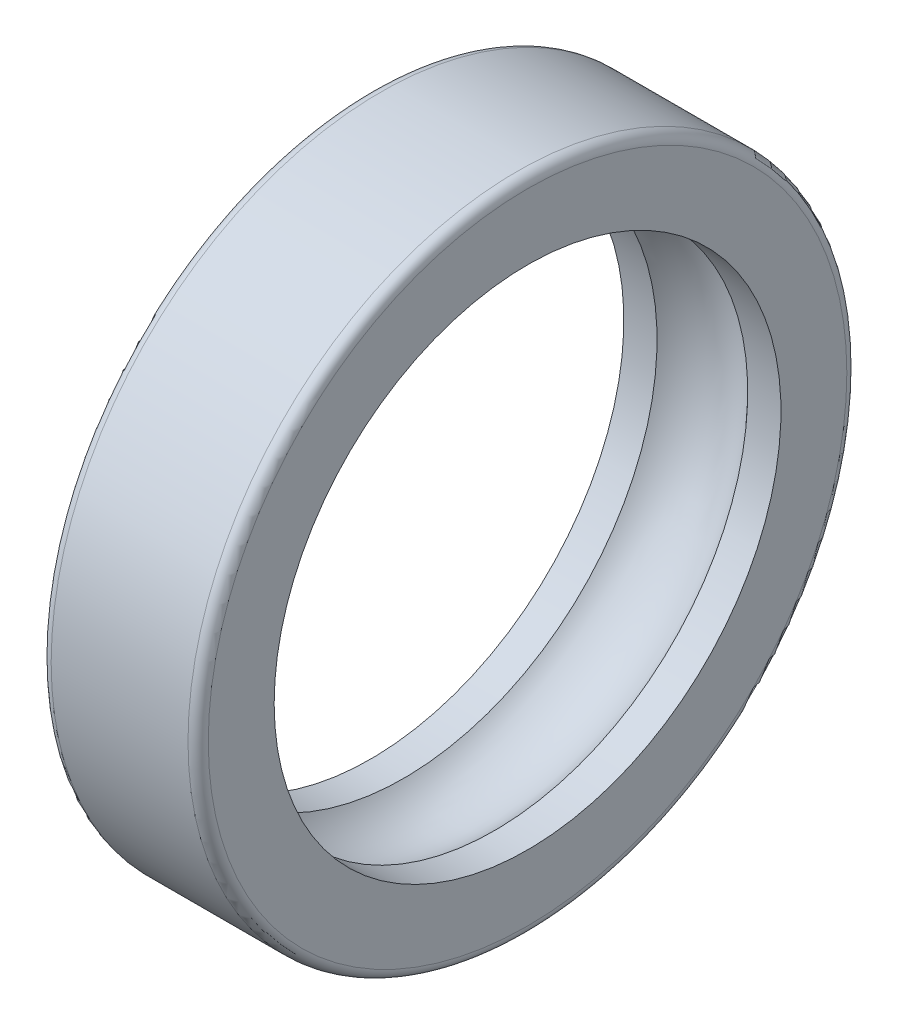
ISO-10303-21;
HEADER;
FILE_DESCRIPTION(('STEP AP214'),'2;1');
FILE_NAME('part.step','',(''),(''),'','','');
FILE_SCHEMA(('AUTOMOTIVE_DESIGN { 1 0 10303 214 1 1 1 1 }'));
ENDSEC;
DATA;
#1=APPLICATION_CONTEXT('core data for automotive mechanical design processes');
#2=APPLICATION_PROTOCOL_DEFINITION('international standard','automotive_design',2000,#1);
#3=PRODUCT_CONTEXT('',#1,'mechanical');
#4=PRODUCT('Part','Part','',(#3));
#5=PRODUCT_RELATED_PRODUCT_CATEGORY('part','',(#4));
#6=PRODUCT_DEFINITION_FORMATION('','',#4);
#7=PRODUCT_DEFINITION_CONTEXT('part definition',#1,'design');
#8=PRODUCT_DEFINITION('design','',#6,#7);
#9=PRODUCT_DEFINITION_SHAPE('','',#8);
#10=(LENGTH_UNIT() NAMED_UNIT(*) SI_UNIT(.MILLI.,.METRE.));
#11=(NAMED_UNIT(*) PLANE_ANGLE_UNIT() SI_UNIT($,.RADIAN.));
#12=(NAMED_UNIT(*) SI_UNIT($,.STERADIAN.) SOLID_ANGLE_UNIT());
#13=UNCERTAINTY_MEASURE_WITH_UNIT(LENGTH_MEASURE(1.E-05),#10,'distance_accuracy_value','');
#14=(GEOMETRIC_REPRESENTATION_CONTEXT(3) GLOBAL_UNCERTAINTY_ASSIGNED_CONTEXT((#13)) GLOBAL_UNIT_ASSIGNED_CONTEXT((#10,
#11,#12)) REPRESENTATION_CONTEXT('',''));
#15=CARTESIAN_POINT('',(0.,0.,0.));
#16=DIRECTION('',(0.,0.,1.));
#17=DIRECTION('',(1.,0.,0.));
#18=AXIS2_PLACEMENT_3D('',#15,#16,#17);
#19=CARTESIAN_POINT('',(0.,0.,0.));
#20=DIRECTION('',(-1.,0.,0.));
#21=DIRECTION('',(0.,0.,1.));
#22=AXIS2_PLACEMENT_3D('',#19,#20,#21);
#23=CYLINDRICAL_SURFACE('',#22,50.);
#24=CARTESIAN_POINT('',(-8.94427190999917,0.,0.));
#25=DIRECTION('',(-1.,0.,0.));
#26=DIRECTION('',(0.,0.,1.));
#27=AXIS2_PLACEMENT_3D('',#24,#25,#26);
#28=CIRCLE('',#27,50.);
#29=CARTESIAN_POINT('',(-8.94427190999917,0.,50.));
#30=VERTEX_POINT('',#29);
#31=EDGE_CURVE('E80',#30,#30,#28,.T.);
#32=ORIENTED_EDGE('',*,*,#31,.F.);
#33=EDGE_LOOP('',(#32));
#34=FACE_BOUND('',#33,.T.);
#35=CARTESIAN_POINT('',(-15.5,0.,0.));
#36=DIRECTION('',(-1.,0.,0.));
#37=DIRECTION('',(0.,0.,1.));
#38=AXIS2_PLACEMENT_3D('',#35,#36,#37);
#39=CIRCLE('',#38,50.);
#40=CARTESIAN_POINT('',(-15.5,0.,50.));
#41=VERTEX_POINT('',#40);
#42=EDGE_CURVE('E10',#41,#41,#39,.T.);
#43=ORIENTED_EDGE('',*,*,#42,.T.);
#44=EDGE_LOOP('',(#43));
#45=FACE_BOUND('',#44,.T.);
#46=ADVANCED_FACE('F45',(#34,#45),#23,.F.);
#47=CARTESIAN_POINT('',(-15.5,63.,0.));
#48=DIRECTION('',(1.,0.,0.));
#49=DIRECTION('',(0.,0.,-1.));
#50=AXIS2_PLACEMENT_3D('',#47,#48,#49);
#51=PLANE('',#50);
#52=ORIENTED_EDGE('',*,*,#42,.F.);
#53=EDGE_LOOP('',(#52));
#54=FACE_BOUND('',#53,.T.);
#55=CARTESIAN_POINT('',(-15.5,0.,0.));
#56=DIRECTION('',(-1.,0.,0.));
#57=DIRECTION('',(0.,0.,1.));
#58=AXIS2_PLACEMENT_3D('',#55,#56,#57);
#59=CIRCLE('',#58,63.);
#60=CARTESIAN_POINT('',(-15.5,0.,63.));
#61=VERTEX_POINT('',#60);
#62=EDGE_CURVE('E52',#61,#61,#59,.T.);
#63=ORIENTED_EDGE('',*,*,#62,.T.);
#64=EDGE_LOOP('',(#63));
#65=FACE_BOUND('',#64,.T.);
#66=ADVANCED_FACE('F88',(#54,#65),#51,.F.);
#67=CARTESIAN_POINT('',(-13.5,0.,0.));
#68=DIRECTION('',(-1.,0.,0.));
#69=DIRECTION('',(0.,0.,1.));
#70=AXIS2_PLACEMENT_3D('',#67,#68,#69);
#71=TOROIDAL_SURFACE('',#70,63.,2.);
#72=ORIENTED_EDGE('',*,*,#62,.F.);
#73=EDGE_LOOP('',(#72));
#74=FACE_BOUND('',#73,.T.);
#75=CARTESIAN_POINT('',(-13.5,0.,0.));
#76=DIRECTION('',(-1.,0.,0.));
#77=DIRECTION('',(0.,0.,1.));
#78=AXIS2_PLACEMENT_3D('',#75,#76,#77);
#79=CIRCLE('',#78,65.);
#80=CARTESIAN_POINT('',(-13.5,0.,65.));
#81=VERTEX_POINT('',#80);
#82=EDGE_CURVE('E57',#81,#81,#79,.T.);
#83=ORIENTED_EDGE('',*,*,#82,.T.);
#84=EDGE_LOOP('',(#83));
#85=FACE_BOUND('',#84,.T.);
#86=ADVANCED_FACE('F92',(#74,#85),#71,.T.);
#87=CARTESIAN_POINT('',(0.,0.,0.));
#88=DIRECTION('',(-1.,0.,0.));
#89=DIRECTION('',(0.,0.,1.));
#90=AXIS2_PLACEMENT_3D('',#87,#88,#89);
#91=CYLINDRICAL_SURFACE('',#90,65.);
#92=ORIENTED_EDGE('',*,*,#82,.F.);
#93=EDGE_LOOP('',(#92));
#94=FACE_BOUND('',#93,.T.);
#95=CARTESIAN_POINT('',(13.5,0.,0.));
#96=DIRECTION('',(-1.,0.,0.));
#97=DIRECTION('',(0.,0.,1.));
#98=AXIS2_PLACEMENT_3D('',#95,#96,#97);
#99=CIRCLE('',#98,65.);
#100=CARTESIAN_POINT('',(13.5,0.,65.));
#101=VERTEX_POINT('',#100);
#102=EDGE_CURVE('E62',#101,#101,#99,.T.);
#103=ORIENTED_EDGE('',*,*,#102,.T.);
#104=EDGE_LOOP('',(#103));
#105=FACE_BOUND('',#104,.T.);
#106=ADVANCED_FACE('F97',(#94,#105),#91,.T.);
#107=CARTESIAN_POINT('',(13.5,0.,0.));
#108=DIRECTION('',(-1.,0.,0.));
#109=DIRECTION('',(0.,0.,1.));
#110=AXIS2_PLACEMENT_3D('',#107,#108,#109);
#111=TOROIDAL_SURFACE('',#110,63.,2.);
#112=ORIENTED_EDGE('',*,*,#102,.F.);
#113=EDGE_LOOP('',(#112));
#114=FACE_BOUND('',#113,.T.);
#115=CARTESIAN_POINT('',(15.5,0.,0.));
#116=DIRECTION('',(-1.,0.,0.));
#117=DIRECTION('',(0.,0.,1.));
#118=AXIS2_PLACEMENT_3D('',#115,#116,#117);
#119=CIRCLE('',#118,63.);
#120=CARTESIAN_POINT('',(15.5,0.,63.));
#121=VERTEX_POINT('',#120);
#122=EDGE_CURVE('E68',#121,#121,#119,.T.);
#123=ORIENTED_EDGE('',*,*,#122,.T.);
#124=EDGE_LOOP('',(#123));
#125=FACE_BOUND('',#124,.T.);
#126=ADVANCED_FACE('F103',(#114,#125),#111,.T.);
#127=CARTESIAN_POINT('',(15.5,50.,0.));
#128=DIRECTION('',(-1.,0.,0.));
#129=DIRECTION('',(0.,0.,1.));
#130=AXIS2_PLACEMENT_3D('',#127,#128,#129);
#131=PLANE('',#130);
#132=ORIENTED_EDGE('',*,*,#122,.F.);
#133=EDGE_LOOP('',(#132));
#134=FACE_BOUND('',#133,.T.);
#135=CARTESIAN_POINT('',(15.5,0.,0.));
#136=DIRECTION('',(-1.,0.,0.));
#137=DIRECTION('',(0.,0.,1.));
#138=AXIS2_PLACEMENT_3D('',#135,#136,#137);
#139=CIRCLE('',#138,50.);
#140=CARTESIAN_POINT('',(15.5,0.,50.));
#141=VERTEX_POINT('',#140);
#142=EDGE_CURVE('E72',#141,#141,#139,.T.);
#143=ORIENTED_EDGE('',*,*,#142,.T.);
#144=EDGE_LOOP('',(#143));
#145=FACE_BOUND('',#144,.T.);
#146=ADVANCED_FACE('F107',(#134,#145),#131,.F.);
#147=CARTESIAN_POINT('',(0.,0.,0.));
#148=DIRECTION('',(-1.,0.,0.));
#149=DIRECTION('',(0.,0.,1.));
#150=AXIS2_PLACEMENT_3D('',#147,#148,#149);
#151=CYLINDRICAL_SURFACE('',#150,50.);
#152=ORIENTED_EDGE('',*,*,#142,.F.);
#153=EDGE_LOOP('',(#152));
#154=FACE_BOUND('',#153,.T.);
#155=CARTESIAN_POINT('',(8.94427190999915,0.,0.));
#156=DIRECTION('',(-1.,0.,0.));
#157=DIRECTION('',(0.,0.,1.));
#158=AXIS2_PLACEMENT_3D('',#155,#156,#157);
#159=CIRCLE('',#158,50.);
#160=CARTESIAN_POINT('',(8.94427190999915,0.,50.));
#161=VERTEX_POINT('',#160);
#162=EDGE_CURVE('E76',#161,#161,#159,.T.);
#163=ORIENTED_EDGE('',*,*,#162,.T.);
#164=EDGE_LOOP('',(#163));
#165=FACE_BOUND('',#164,.T.);
#166=ADVANCED_FACE('F111',(#154,#165),#151,.F.);
#167=CARTESIAN_POINT('',(0.,0.,0.));
#168=DIRECTION('',(-1.,0.,0.));
#169=DIRECTION('',(0.,0.,1.));
#170=AXIS2_PLACEMENT_3D('',#167,#168,#169);
#171=TOROIDAL_SURFACE('',#170,42.,12.);
#172=ORIENTED_EDGE('',*,*,#162,.F.);
#173=EDGE_LOOP('',(#172));
#174=FACE_BOUND('',#173,.T.);
#175=ORIENTED_EDGE('',*,*,#31,.T.);
#176=EDGE_LOOP('',(#175));
#177=FACE_BOUND('',#176,.T.);
#178=ADVANCED_FACE('F85',(#174,#177),#171,.F.);
#179=CLOSED_SHELL('',(#46,#66,#86,#106,#126,#146,#166,#178));
#180=MANIFOLD_SOLID_BREP('B2',#179);
#181=ADVANCED_BREP_SHAPE_REPRESENTATION('',(#18,#180),#14);
#182=SHAPE_DEFINITION_REPRESENTATION(#9,#181);
ENDSEC;
END-ISO-10303-21;
